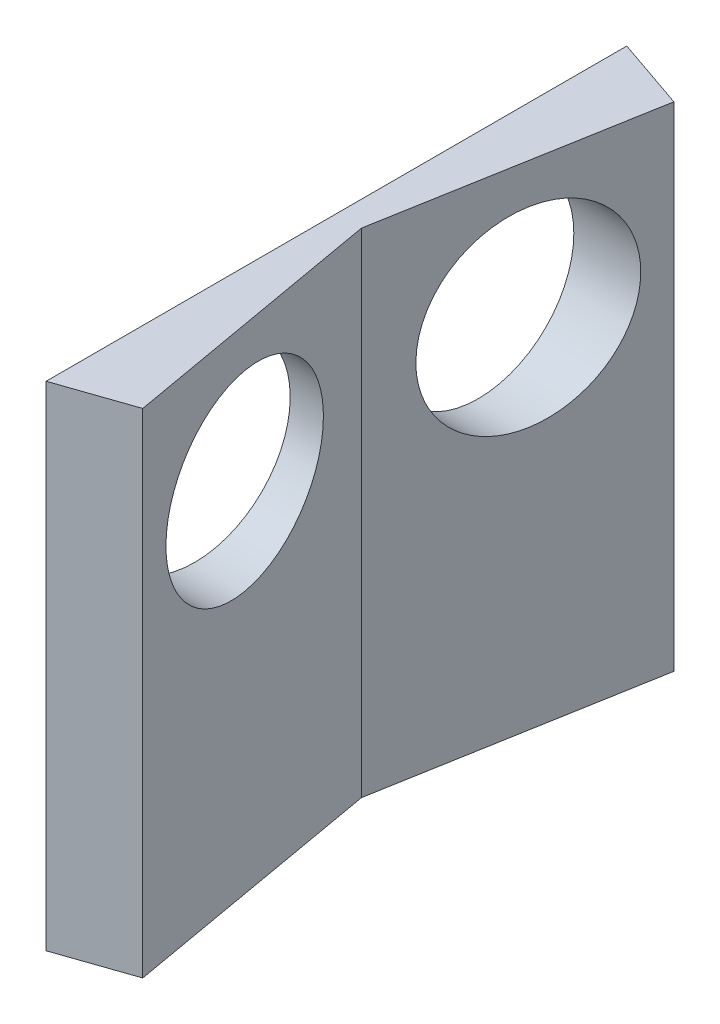
ISO-10303-21;
HEADER;
FILE_DESCRIPTION(('STEP AP214'),'2;1');
FILE_NAME('part.step','',(''),(''),'','','');
FILE_SCHEMA(('AUTOMOTIVE_DESIGN { 1 0 10303 214 1 1 1 1 }'));
ENDSEC;
DATA;
#1=APPLICATION_CONTEXT('core data for automotive mechanical design processes');
#2=APPLICATION_PROTOCOL_DEFINITION('international standard','automotive_design',2000,#1);
#3=PRODUCT_CONTEXT('',#1,'mechanical');
#4=PRODUCT('Part','Part','',(#3));
#5=PRODUCT_RELATED_PRODUCT_CATEGORY('part','',(#4));
#6=PRODUCT_DEFINITION_FORMATION('','',#4);
#7=PRODUCT_DEFINITION_CONTEXT('part definition',#1,'design');
#8=PRODUCT_DEFINITION('design','',#6,#7);
#9=PRODUCT_DEFINITION_SHAPE('','',#8);
#10=(LENGTH_UNIT() NAMED_UNIT(*) SI_UNIT(.MILLI.,.METRE.));
#11=(NAMED_UNIT(*) PLANE_ANGLE_UNIT() SI_UNIT($,.RADIAN.));
#12=(NAMED_UNIT(*) SI_UNIT($,.STERADIAN.) SOLID_ANGLE_UNIT());
#13=UNCERTAINTY_MEASURE_WITH_UNIT(LENGTH_MEASURE(1.E-05),#10,'distance_accuracy_value','');
#14=(GEOMETRIC_REPRESENTATION_CONTEXT(3) GLOBAL_UNCERTAINTY_ASSIGNED_CONTEXT((#13)) GLOBAL_UNIT_ASSIGNED_CONTEXT((#10,
#11,#12)) REPRESENTATION_CONTEXT('',''));
#15=CARTESIAN_POINT('',(0.,0.,0.));
#16=DIRECTION('',(0.,0.,1.));
#17=DIRECTION('',(1.,0.,0.));
#18=AXIS2_PLACEMENT_3D('',#15,#16,#17);
#19=CARTESIAN_POINT('',(5.82835743719329,40.,-21.5367166055002));
#20=DIRECTION('',(-0.325773721330723,0.,0.945447768250755));
#21=DIRECTION('',(0.945447768250755,0.,0.325773721330723));
#22=AXIS2_PLACEMENT_3D('',#19,#20,#21);
#23=PLANE('',#22);
#24=DIRECTION('',(-0.945447768250755,0.,-0.325773721330723));
#25=VECTOR('',#24,1.);
#26=CARTESIAN_POINT('',(5.82835743719329,0.,-21.5367166055002));
#27=LINE('',#26,#25);
#28=CARTESIAN_POINT('',(5.82835743719329,0.,-21.5367166055002));
#29=VERTEX_POINT('',#28);
#30=CARTESIAN_POINT('',(0.,0.,-23.5449985596403));
#31=VERTEX_POINT('',#30);
#32=EDGE_CURVE('E124',#29,#31,#27,.T.);
#33=ORIENTED_EDGE('',*,*,#32,.T.);
#34=DIRECTION('',(0.,-1.,0.));
#35=VECTOR('',#34,1.);
#36=CARTESIAN_POINT('',(0.,40.,-23.5449985596403));
#37=LINE('',#36,#35);
#38=CARTESIAN_POINT('',(0.,40.,-23.5449985596403));
#39=VERTEX_POINT('',#38);
#40=EDGE_CURVE('E11',#39,#31,#37,.T.);
#41=ORIENTED_EDGE('',*,*,#40,.F.);
#42=DIRECTION('',(-0.945447768250755,0.,-0.325773721330723));
#43=VECTOR('',#42,1.);
#44=CARTESIAN_POINT('',(5.82835743719329,40.,-21.5367166055002));
#45=LINE('',#44,#43);
#46=CARTESIAN_POINT('',(5.82835743719329,40.,-21.5367166055002));
#47=VERTEX_POINT('',#46);
#48=EDGE_CURVE('E138',#47,#39,#45,.T.);
#49=ORIENTED_EDGE('',*,*,#48,.F.);
#50=DIRECTION('',(0.,-1.,0.));
#51=VECTOR('',#50,1.);
#52=CARTESIAN_POINT('',(5.82835743719329,40.,-21.5367166055002));
#53=LINE('',#52,#51);
#54=EDGE_CURVE('E120',#47,#29,#53,.T.);
#55=ORIENTED_EDGE('',*,*,#54,.T.);
#56=EDGE_LOOP('',(#33,#41,#49,#55));
#57=FACE_BOUND('',#56,.T.);
#58=ADVANCED_FACE('F45',(#57),#23,.F.);
#59=CARTESIAN_POINT('',(0.,40.,-23.5449985596403));
#60=DIRECTION('',(1.,0.,0.));
#61=DIRECTION('',(0.,0.,-1.));
#62=AXIS2_PLACEMENT_3D('',#59,#60,#61);
#63=PLANE('',#62);
#64=CARTESIAN_POINT('',(0.,29.,-11.4999999999994));
#65=DIRECTION('',(-1.,0.,0.));
#66=DIRECTION('',(0.,0.,1.));
#67=AXIS2_PLACEMENT_3D('',#64,#65,#66);
#68=CIRCLE('',#67,7.75);
#69=CARTESIAN_POINT('',(0.,29.,-3.74999999999936));
#70=VERTEX_POINT('',#69);
#71=EDGE_CURVE('E129',#70,#70,#68,.T.);
#72=ORIENTED_EDGE('',*,*,#71,.F.);
#73=EDGE_LOOP('',(#72));
#74=FACE_BOUND('',#73,.T.);
#75=CARTESIAN_POINT('',(0.,29.,11.5000000000006));
#76=DIRECTION('',(-1.,0.,0.));
#77=DIRECTION('',(0.,0.,1.));
#78=AXIS2_PLACEMENT_3D('',#75,#76,#77);
#79=CIRCLE('',#78,7.75);
#80=CARTESIAN_POINT('',(0.,29.,19.2500000000006));
#81=VERTEX_POINT('',#80);
#82=EDGE_CURVE('E177',#81,#81,#79,.T.);
#83=ORIENTED_EDGE('',*,*,#82,.F.);
#84=EDGE_LOOP('',(#83));
#85=FACE_BOUND('',#84,.T.);
#86=DIRECTION('',(0.,0.,1.));
#87=VECTOR('',#86,1.);
#88=CARTESIAN_POINT('',(0.,0.,-23.5449985596403));
#89=LINE('',#88,#87);
#90=CARTESIAN_POINT('',(0.,0.,23.5449985596403));
#91=VERTEX_POINT('',#90);
#92=EDGE_CURVE('E128',#31,#91,#89,.T.);
#93=ORIENTED_EDGE('',*,*,#92,.T.);
#94=DIRECTION('',(0.,-1.,0.));
#95=VECTOR('',#94,1.);
#96=CARTESIAN_POINT('',(0.,40.,23.5449985596403));
#97=LINE('',#96,#95);
#98=CARTESIAN_POINT('',(0.,40.,23.5449985596403));
#99=VERTEX_POINT('',#98);
#100=EDGE_CURVE('E54',#99,#91,#97,.T.);
#101=ORIENTED_EDGE('',*,*,#100,.F.);
#102=DIRECTION('',(0.,0.,1.));
#103=VECTOR('',#102,1.);
#104=CARTESIAN_POINT('',(0.,40.,-23.5449985596403));
#105=LINE('',#104,#103);
#106=EDGE_CURVE('E96',#39,#99,#105,.T.);
#107=ORIENTED_EDGE('',*,*,#106,.F.);
#108=ORIENTED_EDGE('',*,*,#40,.T.);
#109=EDGE_LOOP('',(#93,#101,#107,#108));
#110=FACE_BOUND('',#109,.T.);
#111=ADVANCED_FACE('F163',(#74,#85,#110),#63,.F.);
#112=CARTESIAN_POINT('',(0.,40.,23.5449985596403));
#113=DIRECTION('',(-0.325773721330561,0.,-0.94544776825081));
#114=DIRECTION('',(-0.94544776825081,0.,0.325773721330561));
#115=AXIS2_PLACEMENT_3D('',#112,#113,#114);
#116=PLANE('',#115);
#117=DIRECTION('',(0.94544776825081,0.,-0.325773721330561));
#118=VECTOR('',#117,1.);
#119=CARTESIAN_POINT('',(0.,0.,23.5449985596403));
#120=LINE('',#119,#118);
#121=CARTESIAN_POINT('',(5.82835743719329,0.,21.5367166055013));
#122=VERTEX_POINT('',#121);
#123=EDGE_CURVE('E112',#91,#122,#120,.T.);
#124=ORIENTED_EDGE('',*,*,#123,.T.);
#125=DIRECTION('',(0.,-1.,0.));
#126=VECTOR('',#125,1.);
#127=CARTESIAN_POINT('',(5.82835743719329,40.,21.5367166055013));
#128=LINE('',#127,#126);
#129=CARTESIAN_POINT('',(5.82835743719329,40.,21.5367166055013));
#130=VERTEX_POINT('',#129);
#131=EDGE_CURVE('E109',#130,#122,#128,.T.);
#132=ORIENTED_EDGE('',*,*,#131,.F.);
#133=DIRECTION('',(0.94544776825081,0.,-0.325773721330561));
#134=VECTOR('',#133,1.);
#135=CARTESIAN_POINT('',(0.,40.,23.5449985596403));
#136=LINE('',#135,#134);
#137=EDGE_CURVE('E100',#99,#130,#136,.T.);
#138=ORIENTED_EDGE('',*,*,#137,.F.);
#139=ORIENTED_EDGE('',*,*,#100,.T.);
#140=EDGE_LOOP('',(#124,#132,#138,#139));
#141=FACE_BOUND('',#140,.T.);
#142=ADVANCED_FACE('F110',(#141),#116,.F.);
#143=CARTESIAN_POINT('',(5.82835743719329,40.,21.5367166055013));
#144=DIRECTION('',(-0.984807753012208,0.,0.173648177666931));
#145=DIRECTION('',(0.173648177666931,0.,0.984807753012208));
#146=AXIS2_PLACEMENT_3D('',#143,#144,#145);
#147=PLANE('',#146);
#148=CARTESIAN_POINT('',(4.05861350191884,29.,11.5000000000006));
#149=DIRECTION('',(-0.984807753012208,0.,0.173648177666931));
#150=DIRECTION('',(-0.173648177666931,0.,-0.984807753012208));
#151=AXIS2_PLACEMENT_3D('',#148,#149,#150);
#152=ELLIPSE('',#151,7.86955624211453,7.75);
#153=CARTESIAN_POINT('',(2.69207940142823,29.,3.75000000000064));
#154=VERTEX_POINT('',#153);
#155=EDGE_CURVE('E180',#154,#154,#152,.F.);
#156=ORIENTED_EDGE('',*,*,#155,.F.);
#157=EDGE_LOOP('',(#156));
#158=FACE_BOUND('',#157,.T.);
#159=DIRECTION('',(-0.173648177666931,0.,-0.984807753012208));
#160=VECTOR('',#159,1.);
#161=CARTESIAN_POINT('',(5.82835743719329,0.,21.5367166055013));
#162=LINE('',#161,#160);
#163=CARTESIAN_POINT('',(2.03085322377148,0.,6.38378239159465E-13));
#164=VERTEX_POINT('',#163);
#165=EDGE_CURVE('E82',#122,#164,#162,.T.);
#166=ORIENTED_EDGE('',*,*,#165,.T.);
#167=DIRECTION('',(0.,-1.,0.));
#168=VECTOR('',#167,1.);
#169=CARTESIAN_POINT('',(2.03085322377148,40.,6.38378239159465E-13));
#170=LINE('',#169,#168);
#171=CARTESIAN_POINT('',(2.03085322377148,40.,6.38378239159465E-13));
#172=VERTEX_POINT('',#171);
#173=EDGE_CURVE('E114',#172,#164,#170,.T.);
#174=ORIENTED_EDGE('',*,*,#173,.F.);
#175=DIRECTION('',(-0.173648177666931,0.,-0.984807753012208));
#176=VECTOR('',#175,1.);
#177=CARTESIAN_POINT('',(5.82835743719329,40.,21.5367166055013));
#178=LINE('',#177,#176);
#179=EDGE_CURVE('E104',#130,#172,#178,.T.);
#180=ORIENTED_EDGE('',*,*,#179,.F.);
#181=ORIENTED_EDGE('',*,*,#131,.T.);
#182=EDGE_LOOP('',(#166,#174,#180,#181));
#183=FACE_BOUND('',#182,.T.);
#184=ADVANCED_FACE('F116',(#158,#183),#147,.F.);
#185=CARTESIAN_POINT('',(2.03085322377148,40.,6.38378239159465E-13));
#186=DIRECTION('',(-0.984807753012208,0.,-0.173648177666929));
#187=DIRECTION('',(-0.173648177666929,0.,0.984807753012208));
#188=AXIS2_PLACEMENT_3D('',#185,#186,#187);
#189=PLANE('',#188);
#190=CARTESIAN_POINT('',(4.05861350191882,29.,-11.4999999999994));
#191=DIRECTION('',(-0.984807753012208,0.,-0.173648177666929));
#192=DIRECTION('',(-0.173648177666929,0.,0.984807753012208));
#193=AXIS2_PLACEMENT_3D('',#190,#191,#192);
#194=ELLIPSE('',#193,7.86955624211452,7.75);
#195=CARTESIAN_POINT('',(2.69207940142822,29.,-3.74999999999936));
#196=VERTEX_POINT('',#195);
#197=EDGE_CURVE('E184',#196,#196,#194,.F.);
#198=ORIENTED_EDGE('',*,*,#197,.F.);
#199=EDGE_LOOP('',(#198));
#200=FACE_BOUND('',#199,.T.);
#201=DIRECTION('',(0.17364817766693,0.,-0.984807753012208));
#202=VECTOR('',#201,1.);
#203=CARTESIAN_POINT('',(2.03085322377148,0.,6.38378239159465E-13));
#204=LINE('',#203,#202);
#205=EDGE_CURVE('E88',#164,#29,#204,.T.);
#206=ORIENTED_EDGE('',*,*,#205,.T.);
#207=ORIENTED_EDGE('',*,*,#54,.F.);
#208=DIRECTION('',(0.17364817766693,0.,-0.984807753012208));
#209=VECTOR('',#208,1.);
#210=CARTESIAN_POINT('',(2.03085322377148,40.,6.38378239159465E-13));
#211=LINE('',#210,#209);
#212=EDGE_CURVE('E62',#172,#47,#211,.T.);
#213=ORIENTED_EDGE('',*,*,#212,.F.);
#214=ORIENTED_EDGE('',*,*,#173,.T.);
#215=EDGE_LOOP('',(#206,#207,#213,#214));
#216=FACE_BOUND('',#215,.T.);
#217=ADVANCED_FACE('F149',(#200,#216),#189,.F.);
#218=CARTESIAN_POINT('',(0.,40.,0.));
#219=DIRECTION('',(0.,-1.,0.));
#220=DIRECTION('',(0.,0.,-1.));
#221=AXIS2_PLACEMENT_3D('',#218,#219,#220);
#222=PLANE('',#221);
#223=ORIENTED_EDGE('',*,*,#48,.T.);
#224=ORIENTED_EDGE('',*,*,#106,.T.);
#225=ORIENTED_EDGE('',*,*,#137,.T.);
#226=ORIENTED_EDGE('',*,*,#179,.T.);
#227=ORIENTED_EDGE('',*,*,#212,.T.);
#228=EDGE_LOOP('',(#223,#224,#225,#226,#227));
#229=FACE_BOUND('',#228,.T.);
#230=ADVANCED_FACE('F102',(#229),#222,.F.);
#231=CARTESIAN_POINT('',(0.,0.,0.));
#232=DIRECTION('',(0.,-1.,0.));
#233=DIRECTION('',(0.,0.,-1.));
#234=AXIS2_PLACEMENT_3D('',#231,#232,#233);
#235=PLANE('',#234);
#236=ORIENTED_EDGE('',*,*,#32,.F.);
#237=ORIENTED_EDGE('',*,*,#205,.F.);
#238=ORIENTED_EDGE('',*,*,#165,.F.);
#239=ORIENTED_EDGE('',*,*,#123,.F.);
#240=ORIENTED_EDGE('',*,*,#92,.F.);
#241=EDGE_LOOP('',(#236,#237,#238,#239,#240));
#242=FACE_BOUND('',#241,.T.);
#243=ADVANCED_FACE('F145',(#242),#235,.T.);
#244=CARTESIAN_POINT('',(5.83035743719329,29.,-11.4999999999994));
#245=DIRECTION('',(-1.,0.,0.));
#246=DIRECTION('',(0.,0.,1.));
#247=AXIS2_PLACEMENT_3D('',#244,#245,#246);
#248=CYLINDRICAL_SURFACE('',#247,7.75);
#249=ORIENTED_EDGE('',*,*,#197,.T.);
#250=EDGE_LOOP('',(#249));
#251=FACE_BOUND('',#250,.T.);
#252=ORIENTED_EDGE('',*,*,#71,.T.);
#253=EDGE_LOOP('',(#252));
#254=FACE_BOUND('',#253,.T.);
#255=ADVANCED_FACE('F195',(#251,#254),#248,.F.);
#256=CARTESIAN_POINT('',(5.83035743719329,29.,11.5000000000006));
#257=DIRECTION('',(-1.,0.,0.));
#258=DIRECTION('',(0.,0.,1.));
#259=AXIS2_PLACEMENT_3D('',#256,#257,#258);
#260=CYLINDRICAL_SURFACE('',#259,7.75);
#261=ORIENTED_EDGE('',*,*,#155,.T.);
#262=EDGE_LOOP('',(#261));
#263=FACE_BOUND('',#262,.T.);
#264=ORIENTED_EDGE('',*,*,#82,.T.);
#265=EDGE_LOOP('',(#264));
#266=FACE_BOUND('',#265,.T.);
#267=ADVANCED_FACE('F198',(#263,#266),#260,.F.);
#268=CLOSED_SHELL('',(#58,#111,#142,#184,#217,#230,#243,#255,#267));
#269=MANIFOLD_SOLID_BREP('B2',#268);
#270=ADVANCED_BREP_SHAPE_REPRESENTATION('',(#18,#269),#14);
#271=SHAPE_DEFINITION_REPRESENTATION(#9,#270);
ENDSEC;
END-ISO-10303-21;
